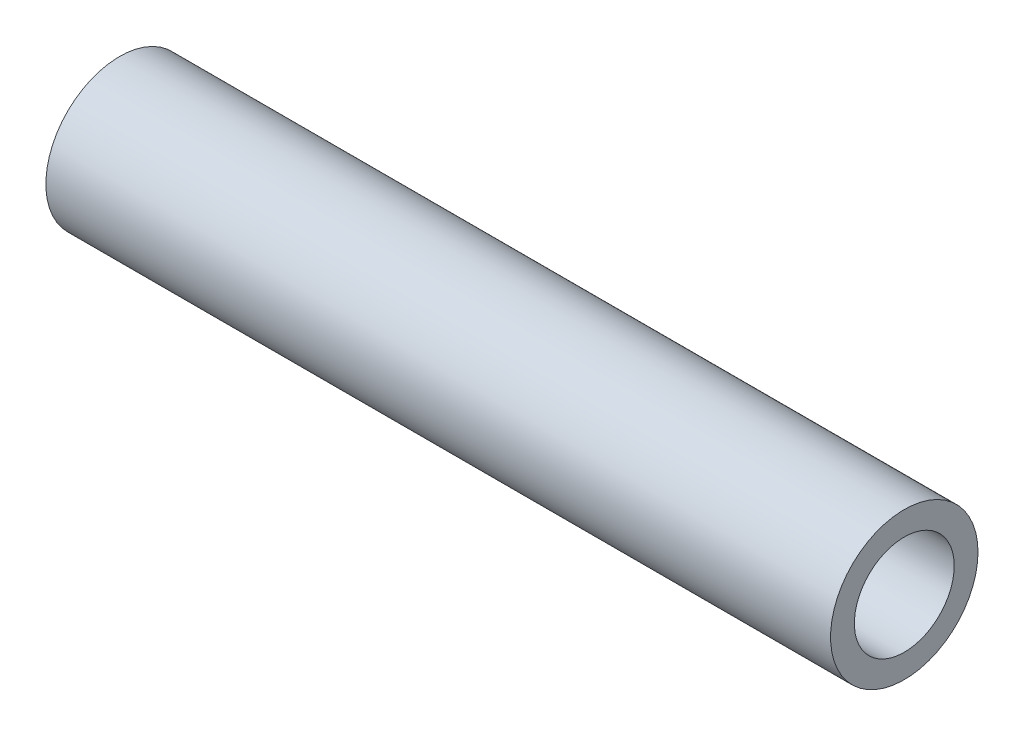
ISO-10303-21;
HEADER;
FILE_DESCRIPTION(('STEP AP214'),'2;1');
FILE_NAME('part.step','',(''),(''),'','','');
FILE_SCHEMA(('AUTOMOTIVE_DESIGN { 1 0 10303 214 1 1 1 1 }'));
ENDSEC;
DATA;
#1=APPLICATION_CONTEXT('core data for automotive mechanical design processes');
#2=APPLICATION_PROTOCOL_DEFINITION('international standard','automotive_design',2000,#1);
#3=PRODUCT_CONTEXT('',#1,'mechanical');
#4=PRODUCT('Part','Part','',(#3));
#5=PRODUCT_RELATED_PRODUCT_CATEGORY('part','',(#4));
#6=PRODUCT_DEFINITION_FORMATION('','',#4);
#7=PRODUCT_DEFINITION_CONTEXT('part definition',#1,'design');
#8=PRODUCT_DEFINITION('design','',#6,#7);
#9=PRODUCT_DEFINITION_SHAPE('','',#8);
#10=(LENGTH_UNIT() NAMED_UNIT(*) SI_UNIT(.MILLI.,.METRE.));
#11=(NAMED_UNIT(*) PLANE_ANGLE_UNIT() SI_UNIT($,.RADIAN.));
#12=(NAMED_UNIT(*) SI_UNIT($,.STERADIAN.) SOLID_ANGLE_UNIT());
#13=UNCERTAINTY_MEASURE_WITH_UNIT(LENGTH_MEASURE(1.E-05),#10,'distance_accuracy_value','');
#14=(GEOMETRIC_REPRESENTATION_CONTEXT(3) GLOBAL_UNCERTAINTY_ASSIGNED_CONTEXT((#13)) GLOBAL_UNIT_ASSIGNED_CONTEXT((#10,
#11,#12)) REPRESENTATION_CONTEXT('',''));
#15=CARTESIAN_POINT('',(0.,0.,0.));
#16=DIRECTION('',(0.,0.,1.));
#17=DIRECTION('',(1.,0.,0.));
#18=AXIS2_PLACEMENT_3D('',#15,#16,#17);
#19=CARTESIAN_POINT('',(33.,0.,0.));
#20=DIRECTION('',(1.,0.,0.));
#21=DIRECTION('',(0.,0.,-1.));
#22=AXIS2_PLACEMENT_3D('',#19,#20,#21);
#23=PLANE('',#22);
#24=CARTESIAN_POINT('',(33.,0.,0.));
#25=DIRECTION('',(1.,0.,0.));
#26=DIRECTION('',(0.,0.,-1.));
#27=AXIS2_PLACEMENT_3D('',#24,#25,#26);
#28=CIRCLE('',#27,3.1);
#29=CARTESIAN_POINT('',(33.,0.,-3.1));
#30=VERTEX_POINT('',#29);
#31=EDGE_CURVE('E10',#30,#30,#28,.T.);
#32=ORIENTED_EDGE('',*,*,#31,.T.);
#33=EDGE_LOOP('',(#32));
#34=FACE_BOUND('',#33,.T.);
#35=CARTESIAN_POINT('',(33.,0.,0.));
#36=DIRECTION('',(1.,0.,0.));
#37=DIRECTION('',(0.,0.,-1.));
#38=AXIS2_PLACEMENT_3D('',#35,#36,#37);
#39=CIRCLE('',#38,2.1);
#40=CARTESIAN_POINT('',(33.,0.,-2.1));
#41=VERTEX_POINT('',#40);
#42=EDGE_CURVE('E48',#41,#41,#39,.T.);
#43=ORIENTED_EDGE('',*,*,#42,.F.);
#44=EDGE_LOOP('',(#43));
#45=FACE_BOUND('',#44,.T.);
#46=ADVANCED_FACE('F40',(#34,#45),#23,.T.);
#47=CARTESIAN_POINT('',(0.,0.,0.));
#48=DIRECTION('',(1.,0.,0.));
#49=DIRECTION('',(0.,0.,-1.));
#50=AXIS2_PLACEMENT_3D('',#47,#48,#49);
#51=PLANE('',#50);
#52=CARTESIAN_POINT('',(0.,0.,0.));
#53=DIRECTION('',(1.,0.,0.));
#54=DIRECTION('',(0.,0.,-1.));
#55=AXIS2_PLACEMENT_3D('',#52,#53,#54);
#56=CIRCLE('',#55,3.1);
#57=CARTESIAN_POINT('',(0.,0.,-3.1));
#58=VERTEX_POINT('',#57);
#59=EDGE_CURVE('E41',#58,#58,#56,.T.);
#60=ORIENTED_EDGE('',*,*,#59,.F.);
#61=EDGE_LOOP('',(#60));
#62=FACE_BOUND('',#61,.T.);
#63=CARTESIAN_POINT('',(0.,0.,0.));
#64=DIRECTION('',(1.,0.,0.));
#65=DIRECTION('',(0.,0.,-1.));
#66=AXIS2_PLACEMENT_3D('',#63,#64,#65);
#67=CIRCLE('',#66,2.1);
#68=CARTESIAN_POINT('',(0.,0.,-2.1));
#69=VERTEX_POINT('',#68);
#70=EDGE_CURVE('E49',#69,#69,#67,.T.);
#71=ORIENTED_EDGE('',*,*,#70,.T.);
#72=EDGE_LOOP('',(#71));
#73=FACE_BOUND('',#72,.T.);
#74=ADVANCED_FACE('F58',(#62,#73),#51,.F.);
#75=CARTESIAN_POINT('',(33.,0.,0.));
#76=DIRECTION('',(-1.,0.,0.));
#77=DIRECTION('',(0.,0.,1.));
#78=AXIS2_PLACEMENT_3D('',#75,#76,#77);
#79=CYLINDRICAL_SURFACE('',#78,3.1);
#80=ORIENTED_EDGE('',*,*,#31,.F.);
#81=EDGE_LOOP('',(#80));
#82=FACE_BOUND('',#81,.T.);
#83=ORIENTED_EDGE('',*,*,#59,.T.);
#84=EDGE_LOOP('',(#83));
#85=FACE_BOUND('',#84,.T.);
#86=ADVANCED_FACE('F39',(#82,#85),#79,.T.);
#87=CARTESIAN_POINT('',(33.,0.,0.));
#88=DIRECTION('',(-1.,0.,0.));
#89=DIRECTION('',(0.,0.,1.));
#90=AXIS2_PLACEMENT_3D('',#87,#88,#89);
#91=CYLINDRICAL_SURFACE('',#90,2.1);
#92=ORIENTED_EDGE('',*,*,#42,.T.);
#93=EDGE_LOOP('',(#92));
#94=FACE_BOUND('',#93,.T.);
#95=ORIENTED_EDGE('',*,*,#70,.F.);
#96=EDGE_LOOP('',(#95));
#97=FACE_BOUND('',#96,.T.);
#98=ADVANCED_FACE('F57',(#94,#97),#91,.F.);
#99=CLOSED_SHELL('',(#46,#74,#86,#98));
#100=MANIFOLD_SOLID_BREP('B2',#99);
#101=ADVANCED_BREP_SHAPE_REPRESENTATION('',(#18,#100),#14);
#102=SHAPE_DEFINITION_REPRESENTATION(#9,#101);
ENDSEC;
END-ISO-10303-21;
